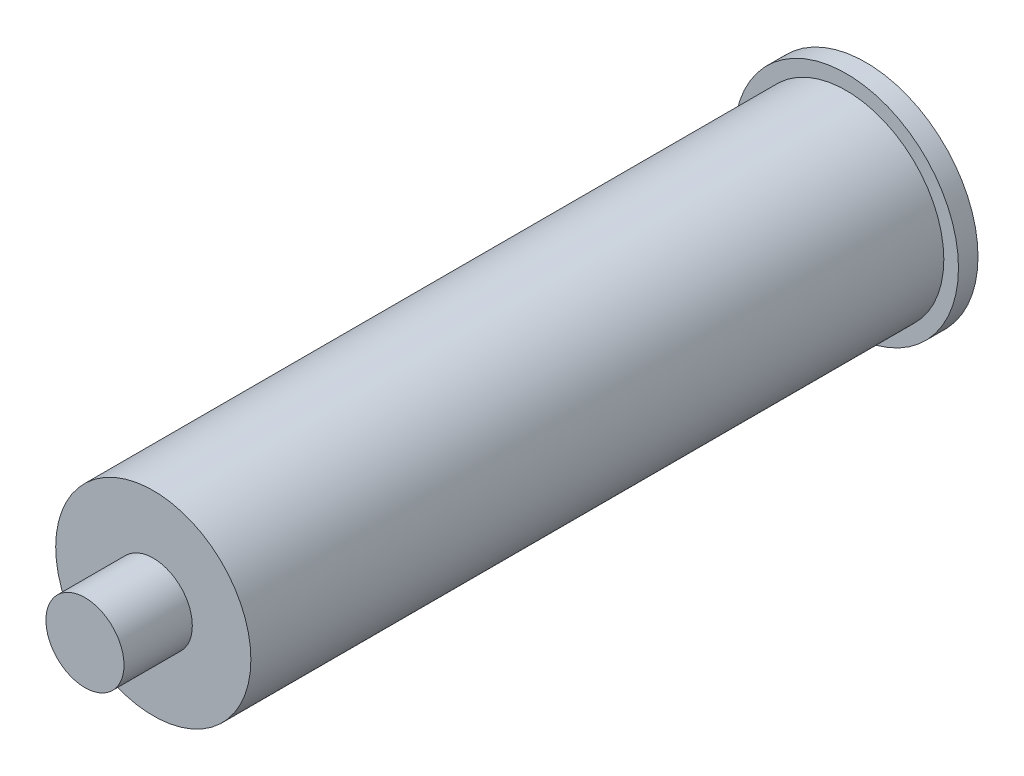
ISO-10303-21;
HEADER;
FILE_DESCRIPTION(('STEP AP214'),'2;1');
FILE_NAME('part.step','',(''),(''),'','','');
FILE_SCHEMA(('AUTOMOTIVE_DESIGN { 1 0 10303 214 1 1 1 1 }'));
ENDSEC;
DATA;
#1=APPLICATION_CONTEXT('core data for automotive mechanical design processes');
#2=APPLICATION_PROTOCOL_DEFINITION('international standard','automotive_design',2000,#1);
#3=PRODUCT_CONTEXT('',#1,'mechanical');
#4=PRODUCT('Part','Part','',(#3));
#5=PRODUCT_RELATED_PRODUCT_CATEGORY('part','',(#4));
#6=PRODUCT_DEFINITION_FORMATION('','',#4);
#7=PRODUCT_DEFINITION_CONTEXT('part definition',#1,'design');
#8=PRODUCT_DEFINITION('design','',#6,#7);
#9=PRODUCT_DEFINITION_SHAPE('','',#8);
#10=(LENGTH_UNIT() NAMED_UNIT(*) SI_UNIT(.MILLI.,.METRE.));
#11=(NAMED_UNIT(*) PLANE_ANGLE_UNIT() SI_UNIT($,.RADIAN.));
#12=(NAMED_UNIT(*) SI_UNIT($,.STERADIAN.) SOLID_ANGLE_UNIT());
#13=UNCERTAINTY_MEASURE_WITH_UNIT(LENGTH_MEASURE(1.E-05),#10,'distance_accuracy_value','');
#14=(GEOMETRIC_REPRESENTATION_CONTEXT(3) GLOBAL_UNCERTAINTY_ASSIGNED_CONTEXT((#13)) GLOBAL_UNIT_ASSIGNED_CONTEXT((#10,
#11,#12)) REPRESENTATION_CONTEXT('',''));
#15=CARTESIAN_POINT('',(0.,0.,0.));
#16=DIRECTION('',(0.,0.,1.));
#17=DIRECTION('',(1.,0.,0.));
#18=AXIS2_PLACEMENT_3D('',#15,#16,#17);
#19=CARTESIAN_POINT('',(0.,0.,-35.5));
#20=DIRECTION('',(0.,0.,1.));
#21=DIRECTION('',(1.,0.,0.));
#22=AXIS2_PLACEMENT_3D('',#19,#20,#21);
#23=CYLINDRICAL_SURFACE('',#22,10.);
#24=CARTESIAN_POINT('',(0.,0.,-35.5));
#25=DIRECTION('',(0.,0.,-1.));
#26=DIRECTION('',(-1.,0.,0.));
#27=AXIS2_PLACEMENT_3D('',#24,#25,#26);
#28=CIRCLE('',#27,10.);
#29=CARTESIAN_POINT('',(-10.,0.,-35.5));
#30=VERTEX_POINT('',#29);
#31=EDGE_CURVE('E159',#30,#30,#28,.F.);
#32=ORIENTED_EDGE('',*,*,#31,.T.);
#33=EDGE_LOOP('',(#32));
#34=FACE_BOUND('',#33,.T.);
#35=CARTESIAN_POINT('',(0.,0.,35.5));
#36=DIRECTION('',(0.,0.,1.));
#37=DIRECTION('',(1.,0.,0.));
#38=AXIS2_PLACEMENT_3D('',#35,#36,#37);
#39=CIRCLE('',#38,10.);
#40=CARTESIAN_POINT('',(10.,0.,35.5));
#41=VERTEX_POINT('',#40);
#42=EDGE_CURVE('E42',#41,#41,#39,.T.);
#43=ORIENTED_EDGE('',*,*,#42,.F.);
#44=EDGE_LOOP('',(#43));
#45=FACE_BOUND('',#44,.T.);
#46=ADVANCED_FACE('F39',(#34,#45),#23,.T.);
#47=CARTESIAN_POINT('',(0.,0.,35.5));
#48=DIRECTION('',(0.,0.,1.));
#49=DIRECTION('',(1.,0.,0.));
#50=AXIS2_PLACEMENT_3D('',#47,#48,#49);
#51=PLANE('',#50);
#52=CARTESIAN_POINT('',(0.,0.,35.5));
#53=DIRECTION('',(0.,0.,1.));
#54=DIRECTION('',(1.,0.,0.));
#55=AXIS2_PLACEMENT_3D('',#52,#53,#54);
#56=CIRCLE('',#55,4.);
#57=CARTESIAN_POINT('',(4.,0.,35.5));
#58=VERTEX_POINT('',#57);
#59=EDGE_CURVE('E11',#58,#58,#56,.T.);
#60=ORIENTED_EDGE('',*,*,#59,.F.);
#61=EDGE_LOOP('',(#60));
#62=FACE_BOUND('',#61,.T.);
#63=ORIENTED_EDGE('',*,*,#42,.T.);
#64=EDGE_LOOP('',(#63));
#65=FACE_BOUND('',#64,.T.);
#66=ADVANCED_FACE('F196',(#62,#65),#51,.T.);
#67=CARTESIAN_POINT('',(0.,0.,42.5));
#68=DIRECTION('',(0.,0.,-1.));
#69=DIRECTION('',(-1.,0.,0.));
#70=AXIS2_PLACEMENT_3D('',#67,#68,#69);
#71=CYLINDRICAL_SURFACE('',#70,4.);
#72=CARTESIAN_POINT('',(0.,0.,42.5));
#73=DIRECTION('',(0.,0.,1.));
#74=DIRECTION('',(1.,0.,0.));
#75=AXIS2_PLACEMENT_3D('',#72,#73,#74);
#76=CIRCLE('',#75,4.);
#77=CARTESIAN_POINT('',(4.,0.,42.5));
#78=VERTEX_POINT('',#77);
#79=EDGE_CURVE('E129',#78,#78,#76,.T.);
#80=ORIENTED_EDGE('',*,*,#79,.F.);
#81=EDGE_LOOP('',(#80));
#82=FACE_BOUND('',#81,.T.);
#83=ORIENTED_EDGE('',*,*,#59,.T.);
#84=EDGE_LOOP('',(#83));
#85=FACE_BOUND('',#84,.T.);
#86=ADVANCED_FACE('F191',(#82,#85),#71,.T.);
#87=CARTESIAN_POINT('',(0.,0.,42.5));
#88=DIRECTION('',(0.,0.,1.));
#89=DIRECTION('',(1.,0.,0.));
#90=AXIS2_PLACEMENT_3D('',#87,#88,#89);
#91=PLANE('',#90);
#92=ORIENTED_EDGE('',*,*,#79,.T.);
#93=EDGE_LOOP('',(#92));
#94=FACE_BOUND('',#93,.T.);
#95=ADVANCED_FACE('F181',(#94),#91,.T.);
#96=CARTESIAN_POINT('',(0.,0.,-37.5));
#97=DIRECTION('',(0.,0.,-1.));
#98=DIRECTION('',(-1.,0.,0.));
#99=AXIS2_PLACEMENT_3D('',#96,#97,#98);
#100=PLANE('',#99);
#101=CARTESIAN_POINT('',(0.,0.,-37.5));
#102=DIRECTION('',(0.,0.,-1.));
#103=DIRECTION('',(-1.,0.,0.));
#104=AXIS2_PLACEMENT_3D('',#101,#102,#103);
#105=CIRCLE('',#104,11.5);
#106=CARTESIAN_POINT('',(-11.5,0.,-37.5));
#107=VERTEX_POINT('',#106);
#108=EDGE_CURVE('E162',#107,#107,#105,.T.);
#109=ORIENTED_EDGE('',*,*,#108,.T.);
#110=EDGE_LOOP('',(#109));
#111=FACE_BOUND('',#110,.T.);
#112=CARTESIAN_POINT('',(0.,0.,-37.5));
#113=DIRECTION('',(0.,0.,-1.));
#114=DIRECTION('',(-1.,0.,0.));
#115=AXIS2_PLACEMENT_3D('',#112,#113,#114);
#116=CIRCLE('',#115,8.5);
#117=CARTESIAN_POINT('',(-8.5,0.,-37.5));
#118=VERTEX_POINT('',#117);
#119=EDGE_CURVE('E166',#118,#118,#116,.T.);
#120=ORIENTED_EDGE('',*,*,#119,.F.);
#121=EDGE_LOOP('',(#120));
#122=FACE_BOUND('',#121,.T.);
#123=ADVANCED_FACE('F178',(#111,#122),#100,.T.);
#124=CARTESIAN_POINT('',(0.,0.,-35.5));
#125=DIRECTION('',(0.,0.,-1.));
#126=DIRECTION('',(-1.,0.,0.));
#127=AXIS2_PLACEMENT_3D('',#124,#125,#126);
#128=PLANE('',#127);
#129=ORIENTED_EDGE('',*,*,#31,.F.);
#130=EDGE_LOOP('',(#129));
#131=FACE_BOUND('',#130,.T.);
#132=CARTESIAN_POINT('',(0.,0.,-35.5));
#133=DIRECTION('',(0.,0.,-1.));
#134=DIRECTION('',(-1.,0.,0.));
#135=AXIS2_PLACEMENT_3D('',#132,#133,#134);
#136=CIRCLE('',#135,11.5);
#137=CARTESIAN_POINT('',(-11.5,0.,-35.5));
#138=VERTEX_POINT('',#137);
#139=EDGE_CURVE('E163',#138,#138,#136,.T.);
#140=ORIENTED_EDGE('',*,*,#139,.F.);
#141=EDGE_LOOP('',(#140));
#142=FACE_BOUND('',#141,.T.);
#143=ADVANCED_FACE('F180',(#131,#142),#128,.F.);
#144=CARTESIAN_POINT('',(0.,0.,-37.5));
#145=DIRECTION('',(0.,0.,1.));
#146=DIRECTION('',(1.,0.,0.));
#147=AXIS2_PLACEMENT_3D('',#144,#145,#146);
#148=CYLINDRICAL_SURFACE('',#147,11.5);
#149=ORIENTED_EDGE('',*,*,#108,.F.);
#150=EDGE_LOOP('',(#149));
#151=FACE_BOUND('',#150,.T.);
#152=ORIENTED_EDGE('',*,*,#139,.T.);
#153=EDGE_LOOP('',(#152));
#154=FACE_BOUND('',#153,.T.);
#155=ADVANCED_FACE('F188',(#151,#154),#148,.T.);
#156=CARTESIAN_POINT('',(0.,0.,-37.5));
#157=DIRECTION('',(0.,0.,1.));
#158=DIRECTION('',(1.,0.,0.));
#159=AXIS2_PLACEMENT_3D('',#156,#157,#158);
#160=CYLINDRICAL_SURFACE('',#159,8.5);
#161=ORIENTED_EDGE('',*,*,#119,.T.);
#162=EDGE_LOOP('',(#161));
#163=FACE_BOUND('',#162,.T.);
#164=CARTESIAN_POINT('',(0.,0.,-35.5));
#165=DIRECTION('',(0.,0.,-1.));
#166=DIRECTION('',(-1.,0.,0.));
#167=AXIS2_PLACEMENT_3D('',#164,#165,#166);
#168=CIRCLE('',#167,8.5);
#169=CARTESIAN_POINT('',(-8.5,0.,-35.5));
#170=VERTEX_POINT('',#169);
#171=EDGE_CURVE('E169',#170,#170,#168,.T.);
#172=ORIENTED_EDGE('',*,*,#171,.F.);
#173=EDGE_LOOP('',(#172));
#174=FACE_BOUND('',#173,.T.);
#175=ADVANCED_FACE('F175',(#163,#174),#160,.F.);
#176=CARTESIAN_POINT('',(0.,0.,-29.5));
#177=DIRECTION('',(0.,0.,-1.));
#178=DIRECTION('',(-1.,0.,0.));
#179=AXIS2_PLACEMENT_3D('',#176,#177,#178);
#180=PLANE('',#179);
#181=DIRECTION('',(-0.5,0.866025403784439,0.));
#182=VECTOR('',#181,1.);
#183=CARTESIAN_POINT('',(-3.5507041555162,-6.15,-29.5));
#184=LINE('',#183,#182);
#185=CARTESIAN_POINT('',(-3.5507041555162,-6.15,-29.5));
#186=VERTEX_POINT('',#185);
#187=CARTESIAN_POINT('',(-7.1014083110324,0.,-29.5));
#188=VERTEX_POINT('',#187);
#189=EDGE_CURVE('E140',#186,#188,#184,.T.);
#190=ORIENTED_EDGE('',*,*,#189,.T.);
#191=DIRECTION('',(0.5,0.866025403784438,0.));
#192=VECTOR('',#191,1.);
#193=CARTESIAN_POINT('',(-7.1014083110324,0.,-29.5));
#194=LINE('',#193,#192);
#195=CARTESIAN_POINT('',(-3.5507041555162,6.15,-29.5));
#196=VERTEX_POINT('',#195);
#197=EDGE_CURVE('E122',#188,#196,#194,.T.);
#198=ORIENTED_EDGE('',*,*,#197,.T.);
#199=DIRECTION('',(1.,0.,0.));
#200=VECTOR('',#199,1.);
#201=CARTESIAN_POINT('',(-3.5507041555162,6.15,-29.5));
#202=LINE('',#201,#200);
#203=CARTESIAN_POINT('',(3.5507041555162,6.15,-29.5));
#204=VERTEX_POINT('',#203);
#205=EDGE_CURVE('E120',#196,#204,#202,.T.);
#206=ORIENTED_EDGE('',*,*,#205,.T.);
#207=DIRECTION('',(0.5,-0.866025403784438,0.));
#208=VECTOR('',#207,1.);
#209=CARTESIAN_POINT('',(3.5507041555162,6.15,-29.5));
#210=LINE('',#209,#208);
#211=CARTESIAN_POINT('',(7.1014083110324,0.,-29.5));
#212=VERTEX_POINT('',#211);
#213=EDGE_CURVE('E99',#204,#212,#210,.T.);
#214=ORIENTED_EDGE('',*,*,#213,.T.);
#215=DIRECTION('',(-0.5,-0.866025403784438,0.));
#216=VECTOR('',#215,1.);
#217=CARTESIAN_POINT('',(7.1014083110324,0.,-29.5));
#218=LINE('',#217,#216);
#219=CARTESIAN_POINT('',(3.5507041555162,-6.15,-29.5));
#220=VERTEX_POINT('',#219);
#221=EDGE_CURVE('E110',#212,#220,#218,.T.);
#222=ORIENTED_EDGE('',*,*,#221,.T.);
#223=DIRECTION('',(-1.,0.,0.));
#224=VECTOR('',#223,1.);
#225=CARTESIAN_POINT('',(3.5507041555162,-6.15,-29.5));
#226=LINE('',#225,#224);
#227=EDGE_CURVE('E114',#220,#186,#226,.T.);
#228=ORIENTED_EDGE('',*,*,#227,.T.);
#229=EDGE_LOOP('',(#190,#198,#206,#214,#222,#228));
#230=FACE_BOUND('',#229,.T.);
#231=ADVANCED_FACE('F117',(#230),#180,.T.);
#232=CARTESIAN_POINT('',(-3.5507041555162,6.15,-29.5));
#233=DIRECTION('',(0.,1.,0.));
#234=DIRECTION('',(0.,0.,1.));
#235=AXIS2_PLACEMENT_3D('',#232,#233,#234);
#236=PLANE('',#235);
#237=DIRECTION('',(1.,0.,0.));
#238=VECTOR('',#237,1.);
#239=CARTESIAN_POINT('',(-3.5507041555162,6.15,-35.5));
#240=LINE('',#239,#238);
#241=CARTESIAN_POINT('',(-3.5507041555162,6.15,-35.5));
#242=VERTEX_POINT('',#241);
#243=CARTESIAN_POINT('',(3.5507041555162,6.15,-35.5));
#244=VERTEX_POINT('',#243);
#245=EDGE_CURVE('E132',#242,#244,#240,.T.);
#246=ORIENTED_EDGE('',*,*,#245,.T.);
#247=DIRECTION('',(0.,0.,-1.));
#248=VECTOR('',#247,1.);
#249=CARTESIAN_POINT('',(3.5507041555162,6.15,-29.5));
#250=LINE('',#249,#248);
#251=EDGE_CURVE('E107',#204,#244,#250,.T.);
#252=ORIENTED_EDGE('',*,*,#251,.F.);
#253=ORIENTED_EDGE('',*,*,#205,.F.);
#254=DIRECTION('',(0.,0.,-1.));
#255=VECTOR('',#254,1.);
#256=CARTESIAN_POINT('',(-3.5507041555162,6.15,-29.5));
#257=LINE('',#256,#255);
#258=EDGE_CURVE('E144',#196,#242,#257,.T.);
#259=ORIENTED_EDGE('',*,*,#258,.T.);
#260=EDGE_LOOP('',(#246,#252,#253,#259));
#261=FACE_BOUND('',#260,.T.);
#262=ADVANCED_FACE('F154',(#261),#236,.F.);
#263=CARTESIAN_POINT('',(3.5507041555162,6.15,-29.5));
#264=DIRECTION('',(0.866025403784439,0.5,0.));
#265=DIRECTION('',(-0.5,0.866025403784439,0.));
#266=AXIS2_PLACEMENT_3D('',#263,#264,#265);
#267=PLANE('',#266);
#268=DIRECTION('',(0.5,-0.866025403784438,0.));
#269=VECTOR('',#268,1.);
#270=CARTESIAN_POINT('',(3.5507041555162,6.15,-35.5));
#271=LINE('',#270,#269);
#272=CARTESIAN_POINT('',(7.1014083110324,0.,-35.5));
#273=VERTEX_POINT('',#272);
#274=EDGE_CURVE('E102',#244,#273,#271,.T.);
#275=ORIENTED_EDGE('',*,*,#274,.T.);
#276=DIRECTION('',(0.,0.,-1.));
#277=VECTOR('',#276,1.);
#278=CARTESIAN_POINT('',(7.1014083110324,0.,-29.5));
#279=LINE('',#278,#277);
#280=EDGE_CURVE('E95',#212,#273,#279,.T.);
#281=ORIENTED_EDGE('',*,*,#280,.F.);
#282=ORIENTED_EDGE('',*,*,#213,.F.);
#283=ORIENTED_EDGE('',*,*,#251,.T.);
#284=EDGE_LOOP('',(#275,#281,#282,#283));
#285=FACE_BOUND('',#284,.T.);
#286=ADVANCED_FACE('F97',(#285),#267,.F.);
#287=CARTESIAN_POINT('',(7.1014083110324,0.,-29.5));
#288=DIRECTION('',(0.866025403784438,-0.5,0.));
#289=DIRECTION('',(0.5,0.866025403784438,0.));
#290=AXIS2_PLACEMENT_3D('',#287,#288,#289);
#291=PLANE('',#290);
#292=DIRECTION('',(-0.5,-0.866025403784438,0.));
#293=VECTOR('',#292,1.);
#294=CARTESIAN_POINT('',(7.1014083110324,0.,-35.5));
#295=LINE('',#294,#293);
#296=CARTESIAN_POINT('',(3.5507041555162,-6.15,-35.5));
#297=VERTEX_POINT('',#296);
#298=EDGE_CURVE('E136',#273,#297,#295,.T.);
#299=ORIENTED_EDGE('',*,*,#298,.T.);
#300=DIRECTION('',(0.,0.,-1.));
#301=VECTOR('',#300,1.);
#302=CARTESIAN_POINT('',(3.5507041555162,-6.15,-29.5));
#303=LINE('',#302,#301);
#304=EDGE_CURVE('E106',#220,#297,#303,.T.);
#305=ORIENTED_EDGE('',*,*,#304,.F.);
#306=ORIENTED_EDGE('',*,*,#221,.F.);
#307=ORIENTED_EDGE('',*,*,#280,.T.);
#308=EDGE_LOOP('',(#299,#305,#306,#307));
#309=FACE_BOUND('',#308,.T.);
#310=ADVANCED_FACE('F111',(#309),#291,.F.);
#311=CARTESIAN_POINT('',(3.5507041555162,-6.15,-29.5));
#312=DIRECTION('',(0.,-1.,0.));
#313=DIRECTION('',(1.,0.,0.));
#314=AXIS2_PLACEMENT_3D('',#311,#312,#313);
#315=PLANE('',#314);
#316=DIRECTION('',(-1.,0.,0.));
#317=VECTOR('',#316,1.);
#318=CARTESIAN_POINT('',(3.5507041555162,-6.15,-35.5));
#319=LINE('',#318,#317);
#320=CARTESIAN_POINT('',(-3.5507041555162,-6.15,-35.5));
#321=VERTEX_POINT('',#320);
#322=EDGE_CURVE('E138',#297,#321,#319,.T.);
#323=ORIENTED_EDGE('',*,*,#322,.T.);
#324=DIRECTION('',(0.,0.,-1.));
#325=VECTOR('',#324,1.);
#326=CARTESIAN_POINT('',(-3.5507041555162,-6.15,-29.5));
#327=LINE('',#326,#325);
#328=EDGE_CURVE('E62',#186,#321,#327,.T.);
#329=ORIENTED_EDGE('',*,*,#328,.F.);
#330=ORIENTED_EDGE('',*,*,#227,.F.);
#331=ORIENTED_EDGE('',*,*,#304,.T.);
#332=EDGE_LOOP('',(#323,#329,#330,#331));
#333=FACE_BOUND('',#332,.T.);
#334=ADVANCED_FACE('F225',(#333),#315,.F.);
#335=CARTESIAN_POINT('',(-3.5507041555162,-6.15,-29.5));
#336=DIRECTION('',(-0.866025403784439,-0.5,0.));
#337=DIRECTION('',(0.5,-0.866025403784439,0.));
#338=AXIS2_PLACEMENT_3D('',#335,#336,#337);
#339=PLANE('',#338);
#340=DIRECTION('',(-0.5,0.866025403784439,0.));
#341=VECTOR('',#340,1.);
#342=CARTESIAN_POINT('',(-3.5507041555162,-6.15,-35.5));
#343=LINE('',#342,#341);
#344=CARTESIAN_POINT('',(-7.1014083110324,0.,-35.5));
#345=VERTEX_POINT('',#344);
#346=EDGE_CURVE('E54',#321,#345,#343,.T.);
#347=ORIENTED_EDGE('',*,*,#346,.T.);
#348=DIRECTION('',(0.,0.,-1.));
#349=VECTOR('',#348,1.);
#350=CARTESIAN_POINT('',(-7.1014083110324,0.,-29.5));
#351=LINE('',#350,#349);
#352=EDGE_CURVE('E84',#188,#345,#351,.T.);
#353=ORIENTED_EDGE('',*,*,#352,.F.);
#354=ORIENTED_EDGE('',*,*,#189,.F.);
#355=ORIENTED_EDGE('',*,*,#328,.T.);
#356=EDGE_LOOP('',(#347,#353,#354,#355));
#357=FACE_BOUND('',#356,.T.);
#358=ADVANCED_FACE('F228',(#357),#339,.F.);
#359=CARTESIAN_POINT('',(-7.1014083110324,0.,-29.5));
#360=DIRECTION('',(-0.866025403784439,0.5,0.));
#361=DIRECTION('',(-0.5,-0.866025403784439,0.));
#362=AXIS2_PLACEMENT_3D('',#359,#360,#361);
#363=PLANE('',#362);
#364=DIRECTION('',(0.5,0.866025403784438,0.));
#365=VECTOR('',#364,1.);
#366=CARTESIAN_POINT('',(-7.1014083110324,0.,-35.5));
#367=LINE('',#366,#365);
#368=EDGE_CURVE('E128',#345,#242,#367,.T.);
#369=ORIENTED_EDGE('',*,*,#368,.T.);
#370=ORIENTED_EDGE('',*,*,#258,.F.);
#371=ORIENTED_EDGE('',*,*,#197,.F.);
#372=ORIENTED_EDGE('',*,*,#352,.T.);
#373=EDGE_LOOP('',(#369,#370,#371,#372));
#374=FACE_BOUND('',#373,.T.);
#375=ADVANCED_FACE('F147',(#374),#363,.F.);
#376=CARTESIAN_POINT('',(0.,0.,-35.5));
#377=DIRECTION('',(0.,0.,1.));
#378=DIRECTION('',(1.,0.,0.));
#379=AXIS2_PLACEMENT_3D('',#376,#377,#378);
#380=PLANE('',#379);
#381=ORIENTED_EDGE('',*,*,#368,.F.);
#382=ORIENTED_EDGE('',*,*,#346,.F.);
#383=ORIENTED_EDGE('',*,*,#322,.F.);
#384=ORIENTED_EDGE('',*,*,#298,.F.);
#385=ORIENTED_EDGE('',*,*,#274,.F.);
#386=ORIENTED_EDGE('',*,*,#245,.F.);
#387=EDGE_LOOP('',(#381,#382,#383,#384,#385,#386));
#388=FACE_BOUND('',#387,.T.);
#389=ORIENTED_EDGE('',*,*,#171,.T.);
#390=EDGE_LOOP('',(#389));
#391=FACE_BOUND('',#390,.T.);
#392=ADVANCED_FACE('F150',(#388,#391),#380,.F.);
#393=CLOSED_SHELL('',(#46,#66,#86,#95,#123,#143,#155,#175,#231,#262,#286,#310,#334,#358,#375,#392));
#394=MANIFOLD_SOLID_BREP('B2',#393);
#395=ADVANCED_BREP_SHAPE_REPRESENTATION('',(#18,#394),#14);
#396=SHAPE_DEFINITION_REPRESENTATION(#9,#395);
ENDSEC;
END-ISO-10303-21;
